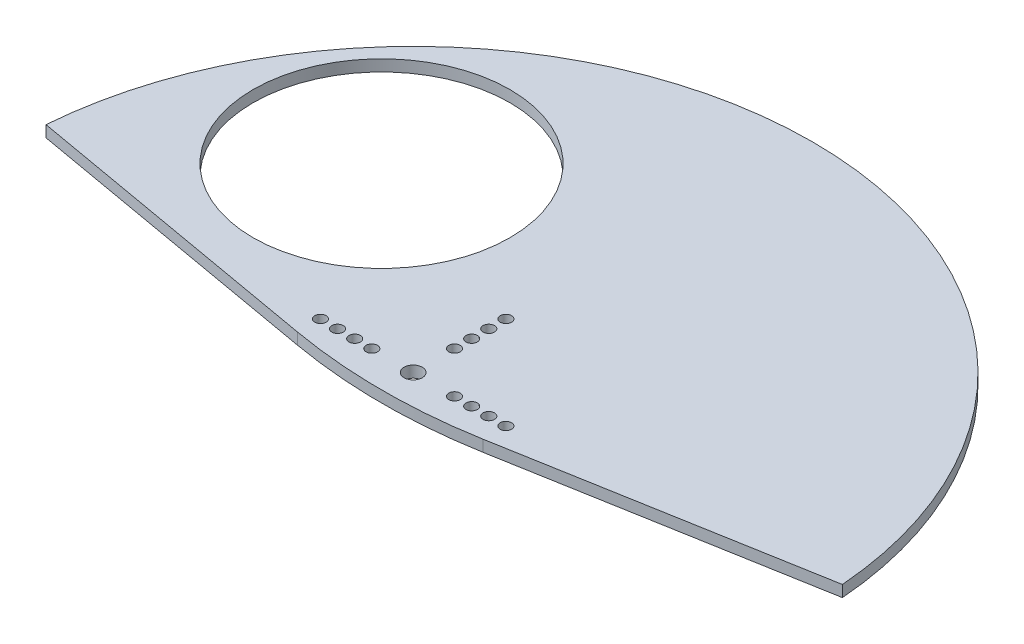
ISO-10303-21;
HEADER;
FILE_DESCRIPTION(('STEP AP214'),'2;1');
FILE_NAME('part.step','',(''),(''),'','','');
FILE_SCHEMA(('AUTOMOTIVE_DESIGN { 1 0 10303 214 1 1 1 1 }'));
ENDSEC;
DATA;
#1=APPLICATION_CONTEXT('core data for automotive mechanical design processes');
#2=APPLICATION_PROTOCOL_DEFINITION('international standard','automotive_design',2000,#1);
#3=PRODUCT_CONTEXT('',#1,'mechanical');
#4=PRODUCT('Part','Part','',(#3));
#5=PRODUCT_RELATED_PRODUCT_CATEGORY('part','',(#4));
#6=PRODUCT_DEFINITION_FORMATION('','',#4);
#7=PRODUCT_DEFINITION_CONTEXT('part definition',#1,'design');
#8=PRODUCT_DEFINITION('design','',#6,#7);
#9=PRODUCT_DEFINITION_SHAPE('','',#8);
#10=(LENGTH_UNIT() NAMED_UNIT(*) SI_UNIT(.MILLI.,.METRE.));
#11=(NAMED_UNIT(*) PLANE_ANGLE_UNIT() SI_UNIT($,.RADIAN.));
#12=(NAMED_UNIT(*) SI_UNIT($,.STERADIAN.) SOLID_ANGLE_UNIT());
#13=UNCERTAINTY_MEASURE_WITH_UNIT(LENGTH_MEASURE(1.E-05),#10,'distance_accuracy_value','');
#14=(GEOMETRIC_REPRESENTATION_CONTEXT(3) GLOBAL_UNCERTAINTY_ASSIGNED_CONTEXT((#13)) GLOBAL_UNIT_ASSIGNED_CONTEXT((#10,
#11,#12)) REPRESENTATION_CONTEXT('',''));
#15=CARTESIAN_POINT('',(0.,0.,0.));
#16=DIRECTION('',(0.,0.,1.));
#17=DIRECTION('',(1.,0.,0.));
#18=AXIS2_PLACEMENT_3D('',#15,#16,#17);
#19=CARTESIAN_POINT('',(-1.17403754660636,1.,6.65829779361715));
#20=DIRECTION('',(0.173648177666932,0.,-0.984807753012208));
#21=DIRECTION('',(-0.984807753012208,0.,-0.173648177666932));
#22=AXIS2_PLACEMENT_3D('',#19,#20,#21);
#23=PLANE('',#22);
#24=DIRECTION('',(0.984807753012208,0.,0.173648177666932));
#25=VECTOR('',#24,1.);
#26=CARTESIAN_POINT('',(-1.17403754660636,-1.,6.65829779361715));
#27=LINE('',#26,#25);
#28=CARTESIAN_POINT('',(-69.7882779884926,-1.,-5.44024405710543));
#29=VERTEX_POINT('',#28);
#30=CARTESIAN_POINT('',(-16.2499934946773,-1.,3.99999999999996));
#31=VERTEX_POINT('',#30);
#32=EDGE_CURVE('E141',#29,#31,#27,.T.);
#33=ORIENTED_EDGE('',*,*,#32,.T.);
#34=DIRECTION('',(0.,-1.,0.));
#35=VECTOR('',#34,1.);
#36=CARTESIAN_POINT('',(-16.2499934946773,1.,3.99999999999996));
#37=LINE('',#36,#35);
#38=CARTESIAN_POINT('',(-16.2499934946773,1.,3.99999999999996));
#39=VERTEX_POINT('',#38);
#40=EDGE_CURVE('E11',#39,#31,#37,.T.);
#41=ORIENTED_EDGE('',*,*,#40,.F.);
#42=DIRECTION('',(0.984807753012208,0.,0.173648177666932));
#43=VECTOR('',#42,1.);
#44=CARTESIAN_POINT('',(-1.17403754660636,1.,6.65829779361715));
#45=LINE('',#44,#43);
#46=CARTESIAN_POINT('',(-69.7882779884926,1.,-5.44024405710543));
#47=VERTEX_POINT('',#46);
#48=EDGE_CURVE('E87',#47,#39,#45,.T.);
#49=ORIENTED_EDGE('',*,*,#48,.F.);
#50=DIRECTION('',(0.,-1.,0.));
#51=VECTOR('',#50,1.);
#52=CARTESIAN_POINT('',(-69.7882779884926,1.,-5.44024405710543));
#53=LINE('',#52,#51);
#54=EDGE_CURVE('E95',#47,#29,#53,.T.);
#55=ORIENTED_EDGE('',*,*,#54,.T.);
#56=EDGE_LOOP('',(#33,#41,#49,#55));
#57=FACE_BOUND('',#56,.T.);
#58=ADVANCED_FACE('F35',(#57),#23,.F.);
#59=CARTESIAN_POINT('',(1.43331527202584E-13,1.,-88.1582926752694));
#60=DIRECTION('',(0.,-1.,0.));
#61=DIRECTION('',(0.,0.,-1.));
#62=AXIS2_PLACEMENT_3D('',#59,#60,#61);
#63=CYLINDRICAL_SURFACE('',#62,93.5799828884237);
#64=CARTESIAN_POINT('',(1.43331527202584E-13,-1.,-88.1582926752694));
#65=DIRECTION('',(0.,1.,0.));
#66=DIRECTION('',(0.,0.,1.));
#67=AXIS2_PLACEMENT_3D('',#64,#65,#66);
#68=CIRCLE('',#67,93.5799828884237);
#69=CARTESIAN_POINT('',(16.2499934946773,-1.,4.));
#70=VERTEX_POINT('',#69);
#71=EDGE_CURVE('E91',#31,#70,#68,.T.);
#72=ORIENTED_EDGE('',*,*,#71,.T.);
#73=DIRECTION('',(0.,-1.,0.));
#74=VECTOR('',#73,1.);
#75=CARTESIAN_POINT('',(16.2499934946773,1.,4.));
#76=LINE('',#75,#74);
#77=CARTESIAN_POINT('',(16.2499934946773,1.,4.));
#78=VERTEX_POINT('',#77);
#79=EDGE_CURVE('E44',#78,#70,#76,.T.);
#80=ORIENTED_EDGE('',*,*,#79,.F.);
#81=CARTESIAN_POINT('',(1.43331527202584E-13,1.,-88.1582926752694));
#82=DIRECTION('',(0.,1.,0.));
#83=DIRECTION('',(0.,0.,1.));
#84=AXIS2_PLACEMENT_3D('',#81,#82,#83);
#85=CIRCLE('',#84,93.5799828884237);
#86=EDGE_CURVE('E82',#39,#78,#85,.T.);
#87=ORIENTED_EDGE('',*,*,#86,.F.);
#88=ORIENTED_EDGE('',*,*,#40,.T.);
#89=EDGE_LOOP('',(#72,#80,#87,#88));
#90=FACE_BOUND('',#89,.T.);
#91=ADVANCED_FACE('F90',(#90),#63,.T.);
#92=CARTESIAN_POINT('',(1.17403754660634,1.,6.65829779361716));
#93=DIRECTION('',(-0.173648177666929,0.,-0.984807753012208));
#94=DIRECTION('',(-0.984807753012208,0.,0.173648177666929));
#95=AXIS2_PLACEMENT_3D('',#92,#93,#94);
#96=PLANE('',#95);
#97=DIRECTION('',(0.984807753012208,0.,-0.173648177666929));
#98=VECTOR('',#97,1.);
#99=CARTESIAN_POINT('',(1.17403754660634,-1.,6.65829779361716));
#100=LINE('',#99,#98);
#101=CARTESIAN_POINT('',(69.7882779884926,-1.,-5.44024405710522));
#102=VERTEX_POINT('',#101);
#103=EDGE_CURVE('E69',#70,#102,#100,.T.);
#104=ORIENTED_EDGE('',*,*,#103,.T.);
#105=DIRECTION('',(0.,-1.,0.));
#106=VECTOR('',#105,1.);
#107=CARTESIAN_POINT('',(69.7882779884926,1.,-5.44024405710522));
#108=LINE('',#107,#106);
#109=CARTESIAN_POINT('',(69.7882779884926,1.,-5.44024405710522));
#110=VERTEX_POINT('',#109);
#111=EDGE_CURVE('E92',#110,#102,#108,.T.);
#112=ORIENTED_EDGE('',*,*,#111,.F.);
#113=DIRECTION('',(0.984807753012208,0.,-0.173648177666929));
#114=VECTOR('',#113,1.);
#115=CARTESIAN_POINT('',(1.17403754660634,1.,6.65829779361716));
#116=LINE('',#115,#114);
#117=EDGE_CURVE('E85',#78,#110,#116,.T.);
#118=ORIENTED_EDGE('',*,*,#117,.F.);
#119=ORIENTED_EDGE('',*,*,#79,.T.);
#120=EDGE_LOOP('',(#104,#112,#118,#119));
#121=FACE_BOUND('',#120,.T.);
#122=ADVANCED_FACE('F93',(#121),#96,.F.);
#123=CARTESIAN_POINT('',(0.,1.,-1.81278603239576E-13));
#124=DIRECTION('',(0.,-1.,0.));
#125=DIRECTION('',(0.,0.,-1.));
#126=AXIS2_PLACEMENT_3D('',#123,#124,#125);
#127=CYLINDRICAL_SURFACE('',#126,1.60000000000001);
#128=CARTESIAN_POINT('',(0.,1.,-1.81278603239576E-13));
#129=DIRECTION('',(0.,1.,0.));
#130=DIRECTION('',(0.,0.,1.));
#131=AXIS2_PLACEMENT_3D('',#128,#129,#130);
#132=CIRCLE('',#131,1.60000000000001);
#133=CARTESIAN_POINT('',(0.,1.,1.59999999999982));
#134=VERTEX_POINT('',#133);
#135=EDGE_CURVE('E154',#134,#134,#132,.T.);
#136=ORIENTED_EDGE('',*,*,#135,.T.);
#137=EDGE_LOOP('',(#136));
#138=FACE_BOUND('',#137,.T.);
#139=CARTESIAN_POINT('',(0.,-1.,-1.81278603239576E-13));
#140=DIRECTION('',(0.,1.,0.));
#141=DIRECTION('',(0.,0.,1.));
#142=AXIS2_PLACEMENT_3D('',#139,#140,#141);
#143=CIRCLE('',#142,1.60000000000001);
#144=CARTESIAN_POINT('',(0.,-1.,1.59999999999982));
#145=VERTEX_POINT('',#144);
#146=EDGE_CURVE('E138',#145,#145,#143,.T.);
#147=ORIENTED_EDGE('',*,*,#146,.F.);
#148=EDGE_LOOP('',(#147));
#149=FACE_BOUND('',#148,.T.);
#150=ADVANCED_FACE('F228',(#138,#149),#127,.F.);
#151=CARTESIAN_POINT('',(0.,1.,-7.24999419525055));
#152=DIRECTION('',(0.,-1.,0.));
#153=DIRECTION('',(0.,0.,-1.));
#154=AXIS2_PLACEMENT_3D('',#151,#152,#153);
#155=CYLINDRICAL_SURFACE('',#154,0.999999999999994);
#156=CARTESIAN_POINT('',(0.,1.,-7.24999419525055));
#157=DIRECTION('',(0.,1.,0.));
#158=DIRECTION('',(0.,0.,1.));
#159=AXIS2_PLACEMENT_3D('',#156,#157,#158);
#160=CIRCLE('',#159,0.999999999999994);
#161=CARTESIAN_POINT('',(0.,1.,-6.24999419525056));
#162=VERTEX_POINT('',#161);
#163=EDGE_CURVE('E156',#162,#162,#160,.T.);
#164=ORIENTED_EDGE('',*,*,#163,.T.);
#165=EDGE_LOOP('',(#164));
#166=FACE_BOUND('',#165,.T.);
#167=CARTESIAN_POINT('',(0.,-1.,-7.24999419525055));
#168=DIRECTION('',(0.,1.,0.));
#169=DIRECTION('',(0.,0.,1.));
#170=AXIS2_PLACEMENT_3D('',#167,#168,#169);
#171=CIRCLE('',#170,0.999999999999994);
#172=CARTESIAN_POINT('',(0.,-1.,-6.24999419525056));
#173=VERTEX_POINT('',#172);
#174=EDGE_CURVE('E135',#173,#173,#171,.T.);
#175=ORIENTED_EDGE('',*,*,#174,.F.);
#176=EDGE_LOOP('',(#175));
#177=FACE_BOUND('',#176,.T.);
#178=ADVANCED_FACE('F231',(#166,#177),#155,.F.);
#179=CARTESIAN_POINT('',(0.,1.,-10.2499917932853));
#180=DIRECTION('',(0.,-1.,0.));
#181=DIRECTION('',(0.,0.,-1.));
#182=AXIS2_PLACEMENT_3D('',#179,#180,#181);
#183=CYLINDRICAL_SURFACE('',#182,0.999999999999998);
#184=CARTESIAN_POINT('',(0.,1.,-10.2499917932853));
#185=DIRECTION('',(0.,1.,0.));
#186=DIRECTION('',(0.,0.,1.));
#187=AXIS2_PLACEMENT_3D('',#184,#185,#186);
#188=CIRCLE('',#187,0.999999999999998);
#189=CARTESIAN_POINT('',(0.,1.,-9.24999179328525));
#190=VERTEX_POINT('',#189);
#191=EDGE_CURVE('E161',#190,#190,#188,.T.);
#192=ORIENTED_EDGE('',*,*,#191,.T.);
#193=EDGE_LOOP('',(#192));
#194=FACE_BOUND('',#193,.T.);
#195=CARTESIAN_POINT('',(0.,-1.,-10.2499917932853));
#196=DIRECTION('',(0.,1.,0.));
#197=DIRECTION('',(0.,0.,1.));
#198=AXIS2_PLACEMENT_3D('',#195,#196,#197);
#199=CIRCLE('',#198,0.999999999999998);
#200=CARTESIAN_POINT('',(0.,-1.,-9.24999179328525));
#201=VERTEX_POINT('',#200);
#202=EDGE_CURVE('E132',#201,#201,#199,.T.);
#203=ORIENTED_EDGE('',*,*,#202,.F.);
#204=EDGE_LOOP('',(#203));
#205=FACE_BOUND('',#204,.T.);
#206=ADVANCED_FACE('F252',(#194,#205),#183,.F.);
#207=CARTESIAN_POINT('',(0.,1.,-13.24998939132));
#208=DIRECTION('',(0.,-1.,0.));
#209=DIRECTION('',(0.,0.,-1.));
#210=AXIS2_PLACEMENT_3D('',#207,#208,#209);
#211=CYLINDRICAL_SURFACE('',#210,1.00000000000001);
#212=CARTESIAN_POINT('',(0.,1.,-13.24998939132));
#213=DIRECTION('',(0.,1.,0.));
#214=DIRECTION('',(0.,0.,1.));
#215=AXIS2_PLACEMENT_3D('',#212,#213,#214);
#216=CIRCLE('',#215,1.00000000000001);
#217=CARTESIAN_POINT('',(0.,1.,-12.24998939132));
#218=VERTEX_POINT('',#217);
#219=EDGE_CURVE('E164',#218,#218,#216,.T.);
#220=ORIENTED_EDGE('',*,*,#219,.T.);
#221=EDGE_LOOP('',(#220));
#222=FACE_BOUND('',#221,.T.);
#223=CARTESIAN_POINT('',(0.,-1.,-13.24998939132));
#224=DIRECTION('',(0.,1.,0.));
#225=DIRECTION('',(0.,0.,1.));
#226=AXIS2_PLACEMENT_3D('',#223,#224,#225);
#227=CIRCLE('',#226,1.00000000000001);
#228=CARTESIAN_POINT('',(0.,-1.,-12.24998939132));
#229=VERTEX_POINT('',#228);
#230=EDGE_CURVE('E129',#229,#229,#227,.T.);
#231=ORIENTED_EDGE('',*,*,#230,.F.);
#232=EDGE_LOOP('',(#231));
#233=FACE_BOUND('',#232,.T.);
#234=ADVANCED_FACE('F256',(#222,#233),#211,.F.);
#235=CARTESIAN_POINT('',(0.,1.,-16.2499934946773));
#236=DIRECTION('',(0.,-1.,0.));
#237=DIRECTION('',(0.,0.,-1.));
#238=AXIS2_PLACEMENT_3D('',#235,#236,#237);
#239=CYLINDRICAL_SURFACE('',#238,1.00000000000006);
#240=CARTESIAN_POINT('',(0.,1.,-16.2499934946773));
#241=DIRECTION('',(0.,1.,0.));
#242=DIRECTION('',(0.,0.,1.));
#243=AXIS2_PLACEMENT_3D('',#240,#241,#242);
#244=CIRCLE('',#243,1.00000000000006);
#245=CARTESIAN_POINT('',(0.,1.,-15.2499934946772));
#246=VERTEX_POINT('',#245);
#247=EDGE_CURVE('E167',#246,#246,#244,.T.);
#248=ORIENTED_EDGE('',*,*,#247,.T.);
#249=EDGE_LOOP('',(#248));
#250=FACE_BOUND('',#249,.T.);
#251=CARTESIAN_POINT('',(0.,-1.,-16.2499934946773));
#252=DIRECTION('',(0.,1.,0.));
#253=DIRECTION('',(0.,0.,1.));
#254=AXIS2_PLACEMENT_3D('',#251,#252,#253);
#255=CIRCLE('',#254,1.00000000000006);
#256=CARTESIAN_POINT('',(0.,-1.,-15.2499934946772));
#257=VERTEX_POINT('',#256);
#258=EDGE_CURVE('E126',#257,#257,#255,.T.);
#259=ORIENTED_EDGE('',*,*,#258,.F.);
#260=EDGE_LOOP('',(#259));
#261=FACE_BOUND('',#260,.T.);
#262=ADVANCED_FACE('F260',(#250,#261),#239,.F.);
#263=CARTESIAN_POINT('',(-7.24999419525055,1.,-1.81083785661708E-13));
#264=DIRECTION('',(0.,-1.,0.));
#265=DIRECTION('',(0.,0.,-1.));
#266=AXIS2_PLACEMENT_3D('',#263,#264,#265);
#267=CYLINDRICAL_SURFACE('',#266,1.);
#268=CARTESIAN_POINT('',(-7.24999419525055,1.,-1.81083785661708E-13));
#269=DIRECTION('',(0.,1.,0.));
#270=DIRECTION('',(0.,0.,1.));
#271=AXIS2_PLACEMENT_3D('',#268,#269,#270);
#272=CIRCLE('',#271,1.);
#273=CARTESIAN_POINT('',(-7.24999419525055,1.,0.999999999999823));
#274=VERTEX_POINT('',#273);
#275=EDGE_CURVE('E170',#274,#274,#272,.T.);
#276=ORIENTED_EDGE('',*,*,#275,.T.);
#277=EDGE_LOOP('',(#276));
#278=FACE_BOUND('',#277,.T.);
#279=CARTESIAN_POINT('',(-7.24999419525055,-1.,-1.81083785661708E-13));
#280=DIRECTION('',(0.,1.,0.));
#281=DIRECTION('',(0.,0.,1.));
#282=AXIS2_PLACEMENT_3D('',#279,#280,#281);
#283=CIRCLE('',#282,1.);
#284=CARTESIAN_POINT('',(-7.24999419525055,-1.,0.999999999999823));
#285=VERTEX_POINT('',#284);
#286=EDGE_CURVE('E123',#285,#285,#283,.T.);
#287=ORIENTED_EDGE('',*,*,#286,.F.);
#288=EDGE_LOOP('',(#287));
#289=FACE_BOUND('',#288,.T.);
#290=ADVANCED_FACE('F264',(#278,#289),#267,.F.);
#291=CARTESIAN_POINT('',(-10.2499917932852,1.,-1.80165601946884E-13));
#292=DIRECTION('',(0.,-1.,0.));
#293=DIRECTION('',(0.,0.,-1.));
#294=AXIS2_PLACEMENT_3D('',#291,#292,#293);
#295=CYLINDRICAL_SURFACE('',#294,1.00000000000003);
#296=CARTESIAN_POINT('',(-10.2499917932852,1.,-1.80165601946884E-13));
#297=DIRECTION('',(0.,1.,0.));
#298=DIRECTION('',(0.,0.,1.));
#299=AXIS2_PLACEMENT_3D('',#296,#297,#298);
#300=CIRCLE('',#299,1.00000000000003);
#301=CARTESIAN_POINT('',(-10.2499917932852,1.,0.999999999999849));
#302=VERTEX_POINT('',#301);
#303=EDGE_CURVE('E173',#302,#302,#300,.T.);
#304=ORIENTED_EDGE('',*,*,#303,.T.);
#305=EDGE_LOOP('',(#304));
#306=FACE_BOUND('',#305,.T.);
#307=CARTESIAN_POINT('',(-10.2499917932852,-1.,-1.80165601946884E-13));
#308=DIRECTION('',(0.,1.,0.));
#309=DIRECTION('',(0.,0.,1.));
#310=AXIS2_PLACEMENT_3D('',#307,#308,#309);
#311=CIRCLE('',#310,1.00000000000003);
#312=CARTESIAN_POINT('',(-10.2499917932852,-1.,0.999999999999849));
#313=VERTEX_POINT('',#312);
#314=EDGE_CURVE('E120',#313,#313,#311,.T.);
#315=ORIENTED_EDGE('',*,*,#314,.F.);
#316=EDGE_LOOP('',(#315));
#317=FACE_BOUND('',#316,.T.);
#318=ADVANCED_FACE('F268',(#306,#317),#295,.F.);
#319=CARTESIAN_POINT('',(-13.24998939132,1.,-1.79247418232061E-13));
#320=DIRECTION('',(0.,-1.,0.));
#321=DIRECTION('',(0.,0.,-1.));
#322=AXIS2_PLACEMENT_3D('',#319,#320,#321);
#323=CYLINDRICAL_SURFACE('',#322,1.00000000000001);
#324=CARTESIAN_POINT('',(-13.24998939132,1.,-1.79247418232061E-13));
#325=DIRECTION('',(0.,1.,0.));
#326=DIRECTION('',(0.,0.,1.));
#327=AXIS2_PLACEMENT_3D('',#324,#325,#326);
#328=CIRCLE('',#327,1.00000000000001);
#329=CARTESIAN_POINT('',(-13.24998939132,1.,0.999999999999831));
#330=VERTEX_POINT('',#329);
#331=EDGE_CURVE('E176',#330,#330,#328,.T.);
#332=ORIENTED_EDGE('',*,*,#331,.T.);
#333=EDGE_LOOP('',(#332));
#334=FACE_BOUND('',#333,.T.);
#335=CARTESIAN_POINT('',(-13.24998939132,-1.,-1.79247418232061E-13));
#336=DIRECTION('',(0.,1.,0.));
#337=DIRECTION('',(0.,0.,1.));
#338=AXIS2_PLACEMENT_3D('',#335,#336,#337);
#339=CIRCLE('',#338,1.00000000000001);
#340=CARTESIAN_POINT('',(-13.24998939132,-1.,0.999999999999831));
#341=VERTEX_POINT('',#340);
#342=EDGE_CURVE('E117',#341,#341,#339,.T.);
#343=ORIENTED_EDGE('',*,*,#342,.F.);
#344=EDGE_LOOP('',(#343));
#345=FACE_BOUND('',#344,.T.);
#346=ADVANCED_FACE('F272',(#334,#345),#323,.F.);
#347=CARTESIAN_POINT('',(-16.2499934946773,1.,-1.78329234517237E-13));
#348=DIRECTION('',(0.,-1.,0.));
#349=DIRECTION('',(0.,0.,-1.));
#350=AXIS2_PLACEMENT_3D('',#347,#348,#349);
#351=CYLINDRICAL_SURFACE('',#350,1.);
#352=CARTESIAN_POINT('',(-16.2499934946773,1.,-1.78329234517237E-13));
#353=DIRECTION('',(0.,1.,0.));
#354=DIRECTION('',(0.,0.,1.));
#355=AXIS2_PLACEMENT_3D('',#352,#353,#354);
#356=CIRCLE('',#355,1.);
#357=CARTESIAN_POINT('',(-16.2499934946773,1.,0.999999999999825));
#358=VERTEX_POINT('',#357);
#359=EDGE_CURVE('E179',#358,#358,#356,.T.);
#360=ORIENTED_EDGE('',*,*,#359,.T.);
#361=EDGE_LOOP('',(#360));
#362=FACE_BOUND('',#361,.T.);
#363=CARTESIAN_POINT('',(-16.2499934946773,-1.,-1.78329234517237E-13));
#364=DIRECTION('',(0.,1.,0.));
#365=DIRECTION('',(0.,0.,1.));
#366=AXIS2_PLACEMENT_3D('',#363,#364,#365);
#367=CIRCLE('',#366,1.);
#368=CARTESIAN_POINT('',(-16.2499934946773,-1.,0.999999999999825));
#369=VERTEX_POINT('',#368);
#370=EDGE_CURVE('E114',#369,#369,#367,.T.);
#371=ORIENTED_EDGE('',*,*,#370,.F.);
#372=EDGE_LOOP('',(#371));
#373=FACE_BOUND('',#372,.T.);
#374=ADVANCED_FACE('F276',(#362,#373),#351,.F.);
#375=CARTESIAN_POINT('',(7.24999419525055,1.,0.));
#376=DIRECTION('',(0.,-1.,0.));
#377=DIRECTION('',(0.,0.,-1.));
#378=AXIS2_PLACEMENT_3D('',#375,#376,#377);
#379=CYLINDRICAL_SURFACE('',#378,0.999999999999997);
#380=CARTESIAN_POINT('',(7.24999419525055,1.,0.));
#381=DIRECTION('',(0.,1.,0.));
#382=DIRECTION('',(0.,0.,1.));
#383=AXIS2_PLACEMENT_3D('',#380,#381,#382);
#384=CIRCLE('',#383,0.999999999999997);
#385=CARTESIAN_POINT('',(7.24999419525055,1.,0.999999999999999));
#386=VERTEX_POINT('',#385);
#387=EDGE_CURVE('E182',#386,#386,#384,.T.);
#388=ORIENTED_EDGE('',*,*,#387,.T.);
#389=EDGE_LOOP('',(#388));
#390=FACE_BOUND('',#389,.T.);
#391=CARTESIAN_POINT('',(7.24999419525055,-1.,0.));
#392=DIRECTION('',(0.,1.,0.));
#393=DIRECTION('',(0.,0.,1.));
#394=AXIS2_PLACEMENT_3D('',#391,#392,#393);
#395=CIRCLE('',#394,0.999999999999997);
#396=CARTESIAN_POINT('',(7.24999419525055,-1.,0.999999999999999));
#397=VERTEX_POINT('',#396);
#398=EDGE_CURVE('E111',#397,#397,#395,.T.);
#399=ORIENTED_EDGE('',*,*,#398,.F.);
#400=EDGE_LOOP('',(#399));
#401=FACE_BOUND('',#400,.T.);
#402=ADVANCED_FACE('F280',(#390,#401),#379,.F.);
#403=CARTESIAN_POINT('',(10.2499917932852,1.,0.));
#404=DIRECTION('',(0.,-1.,0.));
#405=DIRECTION('',(0.,0.,-1.));
#406=AXIS2_PLACEMENT_3D('',#403,#404,#405);
#407=CYLINDRICAL_SURFACE('',#406,0.999999999999965);
#408=CARTESIAN_POINT('',(10.2499917932852,1.,0.));
#409=DIRECTION('',(0.,1.,0.));
#410=DIRECTION('',(0.,0.,1.));
#411=AXIS2_PLACEMENT_3D('',#408,#409,#410);
#412=CIRCLE('',#411,0.999999999999965);
#413=CARTESIAN_POINT('',(10.2499917932852,1.,0.999999999999966));
#414=VERTEX_POINT('',#413);
#415=EDGE_CURVE('E185',#414,#414,#412,.T.);
#416=ORIENTED_EDGE('',*,*,#415,.T.);
#417=EDGE_LOOP('',(#416));
#418=FACE_BOUND('',#417,.T.);
#419=CARTESIAN_POINT('',(10.2499917932852,-1.,0.));
#420=DIRECTION('',(0.,1.,0.));
#421=DIRECTION('',(0.,0.,1.));
#422=AXIS2_PLACEMENT_3D('',#419,#420,#421);
#423=CIRCLE('',#422,0.999999999999965);
#424=CARTESIAN_POINT('',(10.2499917932852,-1.,0.999999999999966));
#425=VERTEX_POINT('',#424);
#426=EDGE_CURVE('E108',#425,#425,#423,.T.);
#427=ORIENTED_EDGE('',*,*,#426,.F.);
#428=EDGE_LOOP('',(#427));
#429=FACE_BOUND('',#428,.T.);
#430=ADVANCED_FACE('F284',(#418,#429),#407,.F.);
#431=CARTESIAN_POINT('',(13.24998939132,1.,0.));
#432=DIRECTION('',(0.,-1.,0.));
#433=DIRECTION('',(0.,0.,-1.));
#434=AXIS2_PLACEMENT_3D('',#431,#432,#433);
#435=CYLINDRICAL_SURFACE('',#434,0.999999999999998);
#436=CARTESIAN_POINT('',(13.24998939132,1.,0.));
#437=DIRECTION('',(0.,1.,0.));
#438=DIRECTION('',(0.,0.,1.));
#439=AXIS2_PLACEMENT_3D('',#436,#437,#438);
#440=CIRCLE('',#439,0.999999999999998);
#441=CARTESIAN_POINT('',(13.24998939132,1.,0.999999999999999));
#442=VERTEX_POINT('',#441);
#443=EDGE_CURVE('E188',#442,#442,#440,.T.);
#444=ORIENTED_EDGE('',*,*,#443,.T.);
#445=EDGE_LOOP('',(#444));
#446=FACE_BOUND('',#445,.T.);
#447=CARTESIAN_POINT('',(13.24998939132,-1.,0.));
#448=DIRECTION('',(0.,1.,0.));
#449=DIRECTION('',(0.,0.,1.));
#450=AXIS2_PLACEMENT_3D('',#447,#448,#449);
#451=CIRCLE('',#450,0.999999999999998);
#452=CARTESIAN_POINT('',(13.24998939132,-1.,0.999999999999999));
#453=VERTEX_POINT('',#452);
#454=EDGE_CURVE('E105',#453,#453,#451,.T.);
#455=ORIENTED_EDGE('',*,*,#454,.F.);
#456=EDGE_LOOP('',(#455));
#457=FACE_BOUND('',#456,.T.);
#458=ADVANCED_FACE('F288',(#446,#457),#435,.F.);
#459=CARTESIAN_POINT('',(16.2499934946773,1.,0.));
#460=DIRECTION('',(0.,-1.,0.));
#461=DIRECTION('',(0.,0.,-1.));
#462=AXIS2_PLACEMENT_3D('',#459,#460,#461);
#463=CYLINDRICAL_SURFACE('',#462,0.999999999999991);
#464=CARTESIAN_POINT('',(16.2499934946773,1.,0.));
#465=DIRECTION('',(0.,1.,0.));
#466=DIRECTION('',(0.,0.,1.));
#467=AXIS2_PLACEMENT_3D('',#464,#465,#466);
#468=CIRCLE('',#467,0.999999999999991);
#469=CARTESIAN_POINT('',(16.2499934946773,1.,0.999999999999991));
#470=VERTEX_POINT('',#469);
#471=EDGE_CURVE('E191',#470,#470,#468,.T.);
#472=ORIENTED_EDGE('',*,*,#471,.T.);
#473=EDGE_LOOP('',(#472));
#474=FACE_BOUND('',#473,.T.);
#475=CARTESIAN_POINT('',(16.2499934946773,-1.,0.));
#476=DIRECTION('',(0.,1.,0.));
#477=DIRECTION('',(0.,0.,1.));
#478=AXIS2_PLACEMENT_3D('',#475,#476,#477);
#479=CIRCLE('',#478,0.999999999999991);
#480=CARTESIAN_POINT('',(16.2499934946773,-1.,0.999999999999991));
#481=VERTEX_POINT('',#480);
#482=EDGE_CURVE('E102',#481,#481,#479,.T.);
#483=ORIENTED_EDGE('',*,*,#482,.F.);
#484=EDGE_LOOP('',(#483));
#485=FACE_BOUND('',#484,.T.);
#486=ADVANCED_FACE('F291',(#474,#485),#463,.F.);
#487=CARTESIAN_POINT('',(-34.471999940354,1.,-28.9254424358943));
#488=DIRECTION('',(0.,-1.,0.));
#489=DIRECTION('',(0.,0.,-1.));
#490=AXIS2_PLACEMENT_3D('',#487,#488,#489);
#491=CYLINDRICAL_SURFACE('',#490,22.5);
#492=CARTESIAN_POINT('',(-34.471999940354,1.,-28.9254424358943));
#493=DIRECTION('',(0.,1.,0.));
#494=DIRECTION('',(0.,0.,1.));
#495=AXIS2_PLACEMENT_3D('',#492,#493,#494);
#496=CIRCLE('',#495,22.5);
#497=CARTESIAN_POINT('',(-34.471999940354,1.,-6.42544243589432));
#498=VERTEX_POINT('',#497);
#499=EDGE_CURVE('E147',#498,#498,#496,.T.);
#500=ORIENTED_EDGE('',*,*,#499,.T.);
#501=EDGE_LOOP('',(#500));
#502=FACE_BOUND('',#501,.T.);
#503=CARTESIAN_POINT('',(-34.471999940354,-1.,-28.9254424358943));
#504=DIRECTION('',(0.,1.,0.));
#505=DIRECTION('',(0.,0.,1.));
#506=AXIS2_PLACEMENT_3D('',#503,#504,#505);
#507=CIRCLE('',#506,22.5);
#508=CARTESIAN_POINT('',(-34.471999940354,-1.,-6.42544243589432));
#509=VERTEX_POINT('',#508);
#510=EDGE_CURVE('E99',#509,#509,#507,.T.);
#511=ORIENTED_EDGE('',*,*,#510,.F.);
#512=EDGE_LOOP('',(#511));
#513=FACE_BOUND('',#512,.T.);
#514=ADVANCED_FACE('F37',(#502,#513),#491,.F.);
#515=CARTESIAN_POINT('',(0.,1.,-1.81278603239576E-13));
#516=DIRECTION('',(0.,-1.,0.));
#517=DIRECTION('',(0.,0.,-1.));
#518=AXIS2_PLACEMENT_3D('',#515,#516,#517);
#519=CYLINDRICAL_SURFACE('',#518,70.);
#520=CARTESIAN_POINT('',(0.,-1.,-1.81278603239576E-13));
#521=DIRECTION('',(0.,1.,0.));
#522=DIRECTION('',(0.,0.,1.));
#523=AXIS2_PLACEMENT_3D('',#520,#521,#522);
#524=CIRCLE('',#523,70.);
#525=EDGE_CURVE('E75',#102,#29,#524,.T.);
#526=ORIENTED_EDGE('',*,*,#525,.T.);
#527=ORIENTED_EDGE('',*,*,#54,.F.);
#528=CARTESIAN_POINT('',(0.,1.,-1.81278603239576E-13));
#529=DIRECTION('',(0.,1.,0.));
#530=DIRECTION('',(0.,0.,1.));
#531=AXIS2_PLACEMENT_3D('',#528,#529,#530);
#532=CIRCLE('',#531,70.);
#533=EDGE_CURVE('E52',#110,#47,#532,.T.);
#534=ORIENTED_EDGE('',*,*,#533,.F.);
#535=ORIENTED_EDGE('',*,*,#111,.T.);
#536=EDGE_LOOP('',(#526,#527,#534,#535));
#537=FACE_BOUND('',#536,.T.);
#538=ADVANCED_FACE('F149',(#537),#519,.T.);
#539=CARTESIAN_POINT('',(0.,1.,0.));
#540=DIRECTION('',(0.,1.,0.));
#541=DIRECTION('',(0.,0.,1.));
#542=AXIS2_PLACEMENT_3D('',#539,#540,#541);
#543=PLANE('',#542);
#544=ORIENTED_EDGE('',*,*,#499,.F.);
#545=EDGE_LOOP('',(#544));
#546=FACE_BOUND('',#545,.T.);
#547=ORIENTED_EDGE('',*,*,#471,.F.);
#548=EDGE_LOOP('',(#547));
#549=FACE_BOUND('',#548,.T.);
#550=ORIENTED_EDGE('',*,*,#443,.F.);
#551=EDGE_LOOP('',(#550));
#552=FACE_BOUND('',#551,.T.);
#553=ORIENTED_EDGE('',*,*,#415,.F.);
#554=EDGE_LOOP('',(#553));
#555=FACE_BOUND('',#554,.T.);
#556=ORIENTED_EDGE('',*,*,#387,.F.);
#557=EDGE_LOOP('',(#556));
#558=FACE_BOUND('',#557,.T.);
#559=ORIENTED_EDGE('',*,*,#359,.F.);
#560=EDGE_LOOP('',(#559));
#561=FACE_BOUND('',#560,.T.);
#562=ORIENTED_EDGE('',*,*,#331,.F.);
#563=EDGE_LOOP('',(#562));
#564=FACE_BOUND('',#563,.T.);
#565=ORIENTED_EDGE('',*,*,#303,.F.);
#566=EDGE_LOOP('',(#565));
#567=FACE_BOUND('',#566,.T.);
#568=ORIENTED_EDGE('',*,*,#275,.F.);
#569=EDGE_LOOP('',(#568));
#570=FACE_BOUND('',#569,.T.);
#571=ORIENTED_EDGE('',*,*,#247,.F.);
#572=EDGE_LOOP('',(#571));
#573=FACE_BOUND('',#572,.T.);
#574=ORIENTED_EDGE('',*,*,#219,.F.);
#575=EDGE_LOOP('',(#574));
#576=FACE_BOUND('',#575,.T.);
#577=ORIENTED_EDGE('',*,*,#191,.F.);
#578=EDGE_LOOP('',(#577));
#579=FACE_BOUND('',#578,.T.);
#580=ORIENTED_EDGE('',*,*,#163,.F.);
#581=EDGE_LOOP('',(#580));
#582=FACE_BOUND('',#581,.T.);
#583=ORIENTED_EDGE('',*,*,#135,.F.);
#584=EDGE_LOOP('',(#583));
#585=FACE_BOUND('',#584,.T.);
#586=ORIENTED_EDGE('',*,*,#48,.T.);
#587=ORIENTED_EDGE('',*,*,#86,.T.);
#588=ORIENTED_EDGE('',*,*,#117,.T.);
#589=ORIENTED_EDGE('',*,*,#533,.T.);
#590=EDGE_LOOP('',(#586,#587,#588,#589));
#591=FACE_BOUND('',#590,.T.);
#592=ADVANCED_FACE('F83',(#546,#549,#552,#555,#558,#561,#564,#567,#570,#573,#576,#579,#582,#585,
#591),#543,.T.);
#593=CARTESIAN_POINT('',(0.,-1.,0.));
#594=DIRECTION('',(0.,1.,0.));
#595=DIRECTION('',(0.,0.,1.));
#596=AXIS2_PLACEMENT_3D('',#593,#594,#595);
#597=PLANE('',#596);
#598=ORIENTED_EDGE('',*,*,#510,.T.);
#599=EDGE_LOOP('',(#598));
#600=FACE_BOUND('',#599,.T.);
#601=ORIENTED_EDGE('',*,*,#482,.T.);
#602=EDGE_LOOP('',(#601));
#603=FACE_BOUND('',#602,.T.);
#604=ORIENTED_EDGE('',*,*,#454,.T.);
#605=EDGE_LOOP('',(#604));
#606=FACE_BOUND('',#605,.T.);
#607=ORIENTED_EDGE('',*,*,#426,.T.);
#608=EDGE_LOOP('',(#607));
#609=FACE_BOUND('',#608,.T.);
#610=ORIENTED_EDGE('',*,*,#398,.T.);
#611=EDGE_LOOP('',(#610));
#612=FACE_BOUND('',#611,.T.);
#613=ORIENTED_EDGE('',*,*,#370,.T.);
#614=EDGE_LOOP('',(#613));
#615=FACE_BOUND('',#614,.T.);
#616=ORIENTED_EDGE('',*,*,#342,.T.);
#617=EDGE_LOOP('',(#616));
#618=FACE_BOUND('',#617,.T.);
#619=ORIENTED_EDGE('',*,*,#314,.T.);
#620=EDGE_LOOP('',(#619));
#621=FACE_BOUND('',#620,.T.);
#622=ORIENTED_EDGE('',*,*,#286,.T.);
#623=EDGE_LOOP('',(#622));
#624=FACE_BOUND('',#623,.T.);
#625=ORIENTED_EDGE('',*,*,#258,.T.);
#626=EDGE_LOOP('',(#625));
#627=FACE_BOUND('',#626,.T.);
#628=ORIENTED_EDGE('',*,*,#230,.T.);
#629=EDGE_LOOP('',(#628));
#630=FACE_BOUND('',#629,.T.);
#631=ORIENTED_EDGE('',*,*,#202,.T.);
#632=EDGE_LOOP('',(#631));
#633=FACE_BOUND('',#632,.T.);
#634=ORIENTED_EDGE('',*,*,#174,.T.);
#635=EDGE_LOOP('',(#634));
#636=FACE_BOUND('',#635,.T.);
#637=ORIENTED_EDGE('',*,*,#146,.T.);
#638=EDGE_LOOP('',(#637));
#639=FACE_BOUND('',#638,.T.);
#640=ORIENTED_EDGE('',*,*,#32,.F.);
#641=ORIENTED_EDGE('',*,*,#525,.F.);
#642=ORIENTED_EDGE('',*,*,#103,.F.);
#643=ORIENTED_EDGE('',*,*,#71,.F.);
#644=EDGE_LOOP('',(#640,#641,#642,#643));
#645=FACE_BOUND('',#644,.T.);
#646=ADVANCED_FACE('F152',(#600,#603,#606,#609,#612,#615,#618,#621,#624,#627,#630,#633,#636,
#639,#645),#597,.F.);
#647=CLOSED_SHELL('',(#58,#91,#122,#150,#178,#206,#234,#262,#290,#318,#346,#374,#402,#430,#458,
#486,#514,#538,#592,#646));
#648=MANIFOLD_SOLID_BREP('B2',#647);
#649=ADVANCED_BREP_SHAPE_REPRESENTATION('',(#18,#648),#14);
#650=SHAPE_DEFINITION_REPRESENTATION(#9,#649);
ENDSEC;
END-ISO-10303-21;
